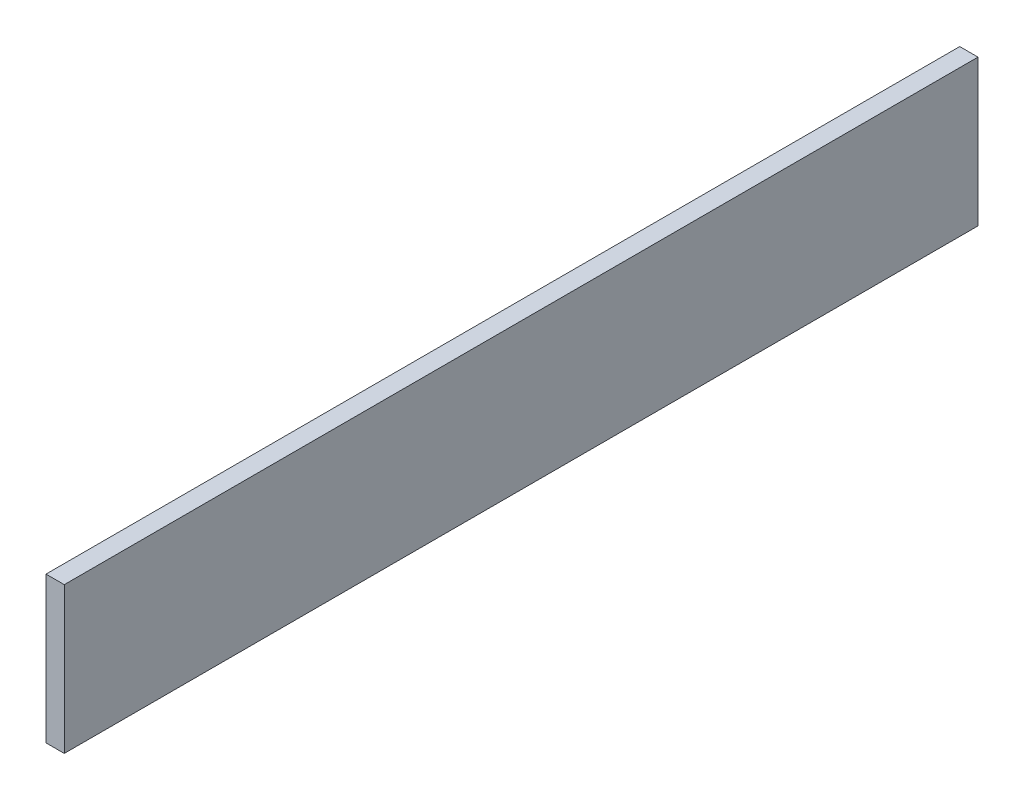
ISO-10303-21;
HEADER;
FILE_DESCRIPTION(('STEP AP214'),'2;1');
FILE_NAME('part.step','',(''),(''),'','','');
FILE_SCHEMA(('AUTOMOTIVE_DESIGN { 1 0 10303 214 1 1 1 1 }'));
ENDSEC;
DATA;
#1=APPLICATION_CONTEXT('core data for automotive mechanical design processes');
#2=APPLICATION_PROTOCOL_DEFINITION('international standard','automotive_design',2000,#1);
#3=PRODUCT_CONTEXT('',#1,'mechanical');
#4=PRODUCT('Part','Part','',(#3));
#5=PRODUCT_RELATED_PRODUCT_CATEGORY('part','',(#4));
#6=PRODUCT_DEFINITION_FORMATION('','',#4);
#7=PRODUCT_DEFINITION_CONTEXT('part definition',#1,'design');
#8=PRODUCT_DEFINITION('design','',#6,#7);
#9=PRODUCT_DEFINITION_SHAPE('','',#8);
#10=(LENGTH_UNIT() NAMED_UNIT(*) SI_UNIT(.MILLI.,.METRE.));
#11=(NAMED_UNIT(*) PLANE_ANGLE_UNIT() SI_UNIT($,.RADIAN.));
#12=(NAMED_UNIT(*) SI_UNIT($,.STERADIAN.) SOLID_ANGLE_UNIT());
#13=UNCERTAINTY_MEASURE_WITH_UNIT(LENGTH_MEASURE(1.E-05),#10,'distance_accuracy_value','');
#14=(GEOMETRIC_REPRESENTATION_CONTEXT(3) GLOBAL_UNCERTAINTY_ASSIGNED_CONTEXT((#13)) GLOBAL_UNIT_ASSIGNED_CONTEXT((#10,
#11,#12)) REPRESENTATION_CONTEXT('',''));
#15=CARTESIAN_POINT('',(0.,0.,0.));
#16=DIRECTION('',(0.,0.,1.));
#17=DIRECTION('',(1.,0.,0.));
#18=AXIS2_PLACEMENT_3D('',#15,#16,#17);
#19=CARTESIAN_POINT('',(8.,90.,500.));
#20=DIRECTION('',(0.,-1.,0.));
#21=DIRECTION('',(0.,0.,-1.));
#22=AXIS2_PLACEMENT_3D('',#19,#20,#21);
#23=PLANE('',#22);
#24=DIRECTION('',(-1.,0.,0.));
#25=VECTOR('',#24,1.);
#26=CARTESIAN_POINT('',(8.,90.,0.));
#27=LINE('',#26,#25);
#28=CARTESIAN_POINT('',(8.,90.,0.));
#29=VERTEX_POINT('',#28);
#30=CARTESIAN_POINT('',(-2.00000000000001,90.,0.));
#31=VERTEX_POINT('',#30);
#32=EDGE_CURVE('E101',#29,#31,#27,.T.);
#33=ORIENTED_EDGE('',*,*,#32,.T.);
#34=DIRECTION('',(0.,0.,-1.));
#35=VECTOR('',#34,1.);
#36=CARTESIAN_POINT('',(-2.00000000000001,90.,500.));
#37=LINE('',#36,#35);
#38=CARTESIAN_POINT('',(-2.00000000000001,90.,500.));
#39=VERTEX_POINT('',#38);
#40=EDGE_CURVE('E11',#39,#31,#37,.T.);
#41=ORIENTED_EDGE('',*,*,#40,.F.);
#42=DIRECTION('',(-1.,0.,0.));
#43=VECTOR('',#42,1.);
#44=CARTESIAN_POINT('',(8.,90.,500.));
#45=LINE('',#44,#43);
#46=CARTESIAN_POINT('',(8.,90.,500.));
#47=VERTEX_POINT('',#46);
#48=EDGE_CURVE('E89',#47,#39,#45,.T.);
#49=ORIENTED_EDGE('',*,*,#48,.F.);
#50=DIRECTION('',(0.,0.,-1.));
#51=VECTOR('',#50,1.);
#52=CARTESIAN_POINT('',(8.,90.,500.));
#53=LINE('',#52,#51);
#54=EDGE_CURVE('E97',#47,#29,#53,.T.);
#55=ORIENTED_EDGE('',*,*,#54,.T.);
#56=EDGE_LOOP('',(#33,#41,#49,#55));
#57=FACE_BOUND('',#56,.T.);
#58=ADVANCED_FACE('F38',(#57),#23,.F.);
#59=CARTESIAN_POINT('',(-2.00000000000001,90.,500.));
#60=DIRECTION('',(1.,0.,0.));
#61=DIRECTION('',(0.,1.,0.));
#62=AXIS2_PLACEMENT_3D('',#59,#60,#61);
#63=PLANE('',#62);
#64=DIRECTION('',(0.,-1.,0.));
#65=VECTOR('',#64,1.);
#66=CARTESIAN_POINT('',(-2.00000000000001,90.,0.));
#67=LINE('',#66,#65);
#68=CARTESIAN_POINT('',(-2.,9.99999999999999,0.));
#69=VERTEX_POINT('',#68);
#70=EDGE_CURVE('E93',#31,#69,#67,.T.);
#71=ORIENTED_EDGE('',*,*,#70,.T.);
#72=DIRECTION('',(0.,0.,-1.));
#73=VECTOR('',#72,1.);
#74=CARTESIAN_POINT('',(-2.,9.99999999999999,500.));
#75=LINE('',#74,#73);
#76=CARTESIAN_POINT('',(-2.,9.99999999999999,500.));
#77=VERTEX_POINT('',#76);
#78=EDGE_CURVE('E46',#77,#69,#75,.T.);
#79=ORIENTED_EDGE('',*,*,#78,.F.);
#80=DIRECTION('',(0.,-1.,0.));
#81=VECTOR('',#80,1.);
#82=CARTESIAN_POINT('',(-2.00000000000001,90.,500.));
#83=LINE('',#82,#81);
#84=EDGE_CURVE('E84',#39,#77,#83,.T.);
#85=ORIENTED_EDGE('',*,*,#84,.F.);
#86=ORIENTED_EDGE('',*,*,#40,.T.);
#87=EDGE_LOOP('',(#71,#79,#85,#86));
#88=FACE_BOUND('',#87,.T.);
#89=ADVANCED_FACE('F92',(#88),#63,.F.);
#90=CARTESIAN_POINT('',(8.,9.99999999999999,500.));
#91=DIRECTION('',(0.,1.,0.));
#92=DIRECTION('',(-1.,0.,0.));
#93=AXIS2_PLACEMENT_3D('',#90,#91,#92);
#94=PLANE('',#93);
#95=DIRECTION('',(1.,0.,0.));
#96=VECTOR('',#95,1.);
#97=CARTESIAN_POINT('',(8.,9.99999999999999,0.));
#98=LINE('',#97,#96);
#99=CARTESIAN_POINT('',(8.,9.99999999999999,0.));
#100=VERTEX_POINT('',#99);
#101=EDGE_CURVE('E71',#69,#100,#98,.T.);
#102=ORIENTED_EDGE('',*,*,#101,.T.);
#103=DIRECTION('',(0.,0.,-1.));
#104=VECTOR('',#103,1.);
#105=CARTESIAN_POINT('',(8.,9.99999999999999,500.));
#106=LINE('',#105,#104);
#107=CARTESIAN_POINT('',(8.,9.99999999999999,500.));
#108=VERTEX_POINT('',#107);
#109=EDGE_CURVE('E94',#108,#100,#106,.T.);
#110=ORIENTED_EDGE('',*,*,#109,.F.);
#111=DIRECTION('',(1.,0.,0.));
#112=VECTOR('',#111,1.);
#113=CARTESIAN_POINT('',(8.,9.99999999999999,500.));
#114=LINE('',#113,#112);
#115=EDGE_CURVE('E87',#77,#108,#114,.T.);
#116=ORIENTED_EDGE('',*,*,#115,.F.);
#117=ORIENTED_EDGE('',*,*,#78,.T.);
#118=EDGE_LOOP('',(#102,#110,#116,#117));
#119=FACE_BOUND('',#118,.T.);
#120=ADVANCED_FACE('F95',(#119),#94,.F.);
#121=CARTESIAN_POINT('',(8.,9.99999999999999,500.));
#122=DIRECTION('',(-1.,0.,0.));
#123=DIRECTION('',(0.,0.,1.));
#124=AXIS2_PLACEMENT_3D('',#121,#122,#123);
#125=PLANE('',#124);
#126=DIRECTION('',(0.,1.,0.));
#127=VECTOR('',#126,1.);
#128=CARTESIAN_POINT('',(8.,9.99999999999999,0.));
#129=LINE('',#128,#127);
#130=EDGE_CURVE('E77',#100,#29,#129,.T.);
#131=ORIENTED_EDGE('',*,*,#130,.T.);
#132=ORIENTED_EDGE('',*,*,#54,.F.);
#133=DIRECTION('',(0.,1.,0.));
#134=VECTOR('',#133,1.);
#135=CARTESIAN_POINT('',(8.,9.99999999999999,500.));
#136=LINE('',#135,#134);
#137=EDGE_CURVE('E54',#108,#47,#136,.T.);
#138=ORIENTED_EDGE('',*,*,#137,.F.);
#139=ORIENTED_EDGE('',*,*,#109,.T.);
#140=EDGE_LOOP('',(#131,#132,#138,#139));
#141=FACE_BOUND('',#140,.T.);
#142=ADVANCED_FACE('F108',(#141),#125,.F.);
#143=CARTESIAN_POINT('',(0.,0.,500.));
#144=DIRECTION('',(0.,0.,1.));
#145=DIRECTION('',(1.,0.,0.));
#146=AXIS2_PLACEMENT_3D('',#143,#144,#145);
#147=PLANE('',#146);
#148=ORIENTED_EDGE('',*,*,#48,.T.);
#149=ORIENTED_EDGE('',*,*,#84,.T.);
#150=ORIENTED_EDGE('',*,*,#115,.T.);
#151=ORIENTED_EDGE('',*,*,#137,.T.);
#152=EDGE_LOOP('',(#148,#149,#150,#151));
#153=FACE_BOUND('',#152,.T.);
#154=ADVANCED_FACE('F85',(#153),#147,.T.);
#155=CARTESIAN_POINT('',(0.,0.,0.));
#156=DIRECTION('',(0.,0.,1.));
#157=DIRECTION('',(1.,0.,0.));
#158=AXIS2_PLACEMENT_3D('',#155,#156,#157);
#159=PLANE('',#158);
#160=ORIENTED_EDGE('',*,*,#32,.F.);
#161=ORIENTED_EDGE('',*,*,#130,.F.);
#162=ORIENTED_EDGE('',*,*,#101,.F.);
#163=ORIENTED_EDGE('',*,*,#70,.F.);
#164=EDGE_LOOP('',(#160,#161,#162,#163));
#165=FACE_BOUND('',#164,.T.);
#166=ADVANCED_FACE('F111',(#165),#159,.F.);
#167=CLOSED_SHELL('',(#58,#89,#120,#142,#154,#166));
#168=MANIFOLD_SOLID_BREP('B2',#167);
#169=ADVANCED_BREP_SHAPE_REPRESENTATION('',(#18,#168),#14);
#170=SHAPE_DEFINITION_REPRESENTATION(#9,#169);
ENDSEC;
END-ISO-10303-21;
